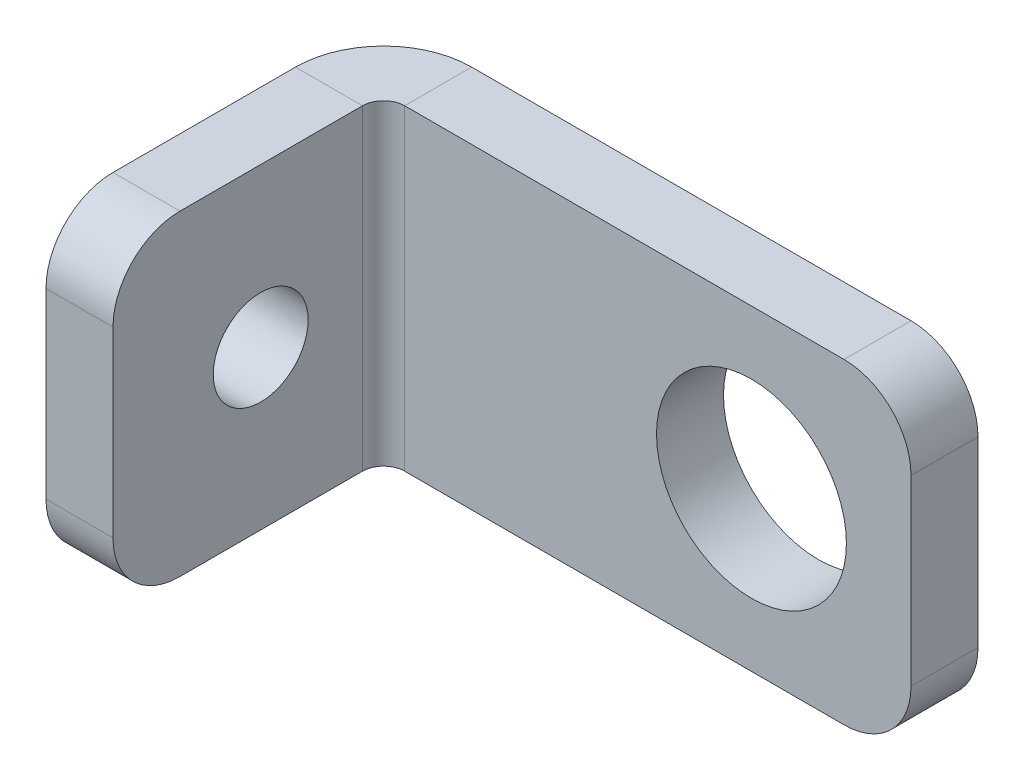
ISO-10303-21;
HEADER;
FILE_DESCRIPTION(('STEP AP214'),'2;1');
FILE_NAME('part.step','',(''),(''),'','','');
FILE_SCHEMA(('AUTOMOTIVE_DESIGN { 1 0 10303 214 1 1 1 1 }'));
ENDSEC;
DATA;
#1=APPLICATION_CONTEXT('core data for automotive mechanical design processes');
#2=APPLICATION_PROTOCOL_DEFINITION('international standard','automotive_design',2000,#1);
#3=PRODUCT_CONTEXT('',#1,'mechanical');
#4=PRODUCT('Part','Part','',(#3));
#5=PRODUCT_RELATED_PRODUCT_CATEGORY('part','',(#4));
#6=PRODUCT_DEFINITION_FORMATION('','',#4);
#7=PRODUCT_DEFINITION_CONTEXT('part definition',#1,'design');
#8=PRODUCT_DEFINITION('design','',#6,#7);
#9=PRODUCT_DEFINITION_SHAPE('','',#8);
#10=(LENGTH_UNIT() NAMED_UNIT(*) SI_UNIT(.MILLI.,.METRE.));
#11=(NAMED_UNIT(*) PLANE_ANGLE_UNIT() SI_UNIT($,.RADIAN.));
#12=(NAMED_UNIT(*) SI_UNIT($,.STERADIAN.) SOLID_ANGLE_UNIT());
#13=UNCERTAINTY_MEASURE_WITH_UNIT(LENGTH_MEASURE(1.E-05),#10,'distance_accuracy_value','');
#14=(GEOMETRIC_REPRESENTATION_CONTEXT(3) GLOBAL_UNCERTAINTY_ASSIGNED_CONTEXT((#13)) GLOBAL_UNIT_ASSIGNED_CONTEXT((#10,
#11,#12)) REPRESENTATION_CONTEXT('',''));
#15=CARTESIAN_POINT('',(0.,0.,0.));
#16=DIRECTION('',(0.,0.,1.));
#17=DIRECTION('',(1.,0.,0.));
#18=AXIS2_PLACEMENT_3D('',#15,#16,#17);
#19=CARTESIAN_POINT('',(-12.5,7.5,3.175));
#20=DIRECTION('',(0.,-1.,0.));
#21=DIRECTION('',(0.,0.,-1.));
#22=AXIS2_PLACEMENT_3D('',#19,#20,#21);
#23=PLANE('',#22);
#24=DIRECTION('',(-1.,0.,0.));
#25=VECTOR('',#24,1.);
#26=CARTESIAN_POINT('',(-12.5,7.5,3.175));
#27=LINE('',#26,#25);
#28=CARTESIAN_POINT('',(9.325,7.5,3.175));
#29=VERTEX_POINT('',#28);
#30=CARTESIAN_POINT('',(-11.5,7.5,3.175));
#31=VERTEX_POINT('',#30);
#32=EDGE_CURVE('E202',#29,#31,#27,.T.);
#33=ORIENTED_EDGE('',*,*,#32,.F.);
#34=DIRECTION('',(0.,0.,-1.));
#35=VECTOR('',#34,1.);
#36=CARTESIAN_POINT('',(9.325,7.5,3.175));
#37=LINE('',#36,#35);
#38=CARTESIAN_POINT('',(9.325,7.5,0.));
#39=VERTEX_POINT('',#38);
#40=EDGE_CURVE('E228',#29,#39,#37,.T.);
#41=ORIENTED_EDGE('',*,*,#40,.T.);
#42=DIRECTION('',(-1.,0.,0.));
#43=VECTOR('',#42,1.);
#44=CARTESIAN_POINT('',(-12.5,7.5,0.));
#45=LINE('',#44,#43);
#46=CARTESIAN_POINT('',(-11.5,7.5,0.));
#47=VERTEX_POINT('',#46);
#48=EDGE_CURVE('E209',#39,#47,#45,.T.);
#49=ORIENTED_EDGE('',*,*,#48,.T.);
#50=DIRECTION('',(0.,0.,-1.));
#51=VECTOR('',#50,1.);
#52=CARTESIAN_POINT('',(-11.5,7.5,3.175));
#53=LINE('',#52,#51);
#54=EDGE_CURVE('E195',#31,#47,#53,.T.);
#55=ORIENTED_EDGE('',*,*,#54,.F.);
#56=EDGE_LOOP('',(#33,#41,#49,#55));
#57=FACE_BOUND('',#56,.T.);
#58=ADVANCED_FACE('F43',(#57),#23,.F.);
#59=CARTESIAN_POINT('',(-12.5,-7.5,3.175));
#60=DIRECTION('',(0.,1.,0.));
#61=DIRECTION('',(0.,0.,1.));
#62=AXIS2_PLACEMENT_3D('',#59,#60,#61);
#63=PLANE('',#62);
#64=DIRECTION('',(1.,0.,0.));
#65=VECTOR('',#64,1.);
#66=CARTESIAN_POINT('',(-12.5,-7.5,0.));
#67=LINE('',#66,#65);
#68=CARTESIAN_POINT('',(-11.5,-7.5,0.));
#69=VERTEX_POINT('',#68);
#70=CARTESIAN_POINT('',(9.325,-7.5,0.));
#71=VERTEX_POINT('',#70);
#72=EDGE_CURVE('E203',#69,#71,#67,.T.);
#73=ORIENTED_EDGE('',*,*,#72,.T.);
#74=DIRECTION('',(0.,0.,-1.));
#75=VECTOR('',#74,1.);
#76=CARTESIAN_POINT('',(9.325,-7.5,3.175));
#77=LINE('',#76,#75);
#78=CARTESIAN_POINT('',(9.325,-7.5,3.175));
#79=VERTEX_POINT('',#78);
#80=EDGE_CURVE('E11',#71,#79,#77,.F.);
#81=ORIENTED_EDGE('',*,*,#80,.T.);
#82=DIRECTION('',(1.,0.,0.));
#83=VECTOR('',#82,1.);
#84=CARTESIAN_POINT('',(-12.5,-7.5,3.175));
#85=LINE('',#84,#83);
#86=CARTESIAN_POINT('',(-11.5,-7.5,3.175));
#87=VERTEX_POINT('',#86);
#88=EDGE_CURVE('E205',#87,#79,#85,.T.);
#89=ORIENTED_EDGE('',*,*,#88,.F.);
#90=DIRECTION('',(0.,0.,-1.));
#91=VECTOR('',#90,1.);
#92=CARTESIAN_POINT('',(-11.5,-7.5,3.175));
#93=LINE('',#92,#91);
#94=EDGE_CURVE('E187',#87,#69,#93,.T.);
#95=ORIENTED_EDGE('',*,*,#94,.T.);
#96=EDGE_LOOP('',(#73,#81,#89,#95));
#97=FACE_BOUND('',#96,.T.);
#98=ADVANCED_FACE('F259',(#97),#63,.F.);
#99=CARTESIAN_POINT('',(0.,0.,3.175));
#100=DIRECTION('',(0.,0.,-1.));
#101=DIRECTION('',(-1.,0.,0.));
#102=AXIS2_PLACEMENT_3D('',#99,#100,#101);
#103=PLANE('',#102);
#104=CARTESIAN_POINT('',(4.93689999991323,-4.73791076063829E-12,3.175));
#105=DIRECTION('',(0.,0.,1.));
#106=DIRECTION('',(1.,0.,0.));
#107=AXIS2_PLACEMENT_3D('',#104,#105,#106);
#108=CIRCLE('',#107,4.5);
#109=CARTESIAN_POINT('',(9.43689999991323,-4.73791076063829E-12,3.175));
#110=VERTEX_POINT('',#109);
#111=EDGE_CURVE('E273',#110,#110,#108,.T.);
#112=ORIENTED_EDGE('',*,*,#111,.F.);
#113=EDGE_LOOP('',(#112));
#114=FACE_BOUND('',#113,.T.);
#115=DIRECTION('',(0.,1.,0.));
#116=VECTOR('',#115,1.);
#117=CARTESIAN_POINT('',(12.5,-7.5,3.175));
#118=LINE('',#117,#116);
#119=CARTESIAN_POINT('',(12.5,-4.325,3.175));
#120=VERTEX_POINT('',#119);
#121=CARTESIAN_POINT('',(12.5,4.325,3.175));
#122=VERTEX_POINT('',#121);
#123=EDGE_CURVE('E200',#120,#122,#118,.T.);
#124=ORIENTED_EDGE('',*,*,#123,.T.);
#125=CARTESIAN_POINT('',(9.325,4.325,3.175));
#126=DIRECTION('',(0.,0.,-1.));
#127=DIRECTION('',(-1.,0.,0.));
#128=AXIS2_PLACEMENT_3D('',#125,#126,#127);
#129=CIRCLE('',#128,3.175);
#130=EDGE_CURVE('E51',#122,#29,#129,.F.);
#131=ORIENTED_EDGE('',*,*,#130,.T.);
#132=ORIENTED_EDGE('',*,*,#32,.T.);
#133=DIRECTION('',(0.,-1.,0.));
#134=VECTOR('',#133,1.);
#135=CARTESIAN_POINT('',(-11.5,-7.5,3.175));
#136=LINE('',#135,#134);
#137=EDGE_CURVE('E191',#87,#31,#136,.F.);
#138=ORIENTED_EDGE('',*,*,#137,.F.);
#139=ORIENTED_EDGE('',*,*,#88,.T.);
#140=CARTESIAN_POINT('',(9.325,-4.325,3.175));
#141=DIRECTION('',(0.,0.,-1.));
#142=DIRECTION('',(-1.,0.,0.));
#143=AXIS2_PLACEMENT_3D('',#140,#141,#142);
#144=CIRCLE('',#143,3.175);
#145=EDGE_CURVE('E239',#79,#120,#144,.F.);
#146=ORIENTED_EDGE('',*,*,#145,.T.);
#147=EDGE_LOOP('',(#124,#131,#132,#138,#139,#146));
#148=FACE_BOUND('',#147,.T.);
#149=ADVANCED_FACE('F243',(#114,#148),#103,.F.);
#150=CARTESIAN_POINT('',(0.,0.,0.));
#151=DIRECTION('',(0.,0.,-1.));
#152=DIRECTION('',(-1.,0.,0.));
#153=AXIS2_PLACEMENT_3D('',#150,#151,#152);
#154=PLANE('',#153);
#155=CARTESIAN_POINT('',(4.93689999991323,-4.73791076063829E-12,0.));
#156=DIRECTION('',(0.,0.,1.));
#157=DIRECTION('',(1.,0.,0.));
#158=AXIS2_PLACEMENT_3D('',#155,#156,#157);
#159=CIRCLE('',#158,4.5);
#160=CARTESIAN_POINT('',(9.43689999991323,-4.73791076063829E-12,0.));
#161=VERTEX_POINT('',#160);
#162=EDGE_CURVE('E269',#161,#161,#159,.T.);
#163=ORIENTED_EDGE('',*,*,#162,.T.);
#164=EDGE_LOOP('',(#163));
#165=FACE_BOUND('',#164,.T.);
#166=ORIENTED_EDGE('',*,*,#48,.F.);
#167=CARTESIAN_POINT('',(9.325,4.325,0.));
#168=DIRECTION('',(0.,0.,-1.));
#169=DIRECTION('',(-1.,0.,0.));
#170=AXIS2_PLACEMENT_3D('',#167,#168,#169);
#171=CIRCLE('',#170,3.175);
#172=CARTESIAN_POINT('',(12.5,4.325,0.));
#173=VERTEX_POINT('',#172);
#174=EDGE_CURVE('E233',#39,#173,#171,.T.);
#175=ORIENTED_EDGE('',*,*,#174,.T.);
#176=DIRECTION('',(0.,1.,0.));
#177=VECTOR('',#176,1.);
#178=CARTESIAN_POINT('',(12.5,-7.5,0.));
#179=LINE('',#178,#177);
#180=CARTESIAN_POINT('',(12.5,-4.325,0.));
#181=VERTEX_POINT('',#180);
#182=EDGE_CURVE('E198',#181,#173,#179,.T.);
#183=ORIENTED_EDGE('',*,*,#182,.F.);
#184=CARTESIAN_POINT('',(9.325,-4.325,0.));
#185=DIRECTION('',(0.,0.,-1.));
#186=DIRECTION('',(-1.,0.,0.));
#187=AXIS2_PLACEMENT_3D('',#184,#185,#186);
#188=CIRCLE('',#187,3.175);
#189=EDGE_CURVE('E231',#181,#71,#188,.T.);
#190=ORIENTED_EDGE('',*,*,#189,.T.);
#191=ORIENTED_EDGE('',*,*,#72,.F.);
#192=DIRECTION('',(0.,-1.,0.));
#193=VECTOR('',#192,1.);
#194=CARTESIAN_POINT('',(-11.5,-7.5,0.));
#195=LINE('',#194,#193);
#196=EDGE_CURVE('E156',#69,#47,#195,.F.);
#197=ORIENTED_EDGE('',*,*,#196,.T.);
#198=EDGE_LOOP('',(#166,#175,#183,#190,#191,#197));
#199=FACE_BOUND('',#198,.T.);
#200=ADVANCED_FACE('F253',(#165,#199),#154,.T.);
#201=CARTESIAN_POINT('',(12.5,-7.5,3.175));
#202=DIRECTION('',(-1.,0.,0.));
#203=DIRECTION('',(0.,0.,1.));
#204=AXIS2_PLACEMENT_3D('',#201,#202,#203);
#205=PLANE('',#204);
#206=ORIENTED_EDGE('',*,*,#182,.T.);
#207=DIRECTION('',(0.,0.,-1.));
#208=VECTOR('',#207,1.);
#209=CARTESIAN_POINT('',(12.5,4.325,3.175));
#210=LINE('',#209,#208);
#211=EDGE_CURVE('E64',#173,#122,#210,.F.);
#212=ORIENTED_EDGE('',*,*,#211,.T.);
#213=ORIENTED_EDGE('',*,*,#123,.F.);
#214=DIRECTION('',(0.,0.,-1.));
#215=VECTOR('',#214,1.);
#216=CARTESIAN_POINT('',(12.5,-4.325,3.175));
#217=LINE('',#216,#215);
#218=EDGE_CURVE('E235',#120,#181,#217,.T.);
#219=ORIENTED_EDGE('',*,*,#218,.T.);
#220=EDGE_LOOP('',(#206,#212,#213,#219));
#221=FACE_BOUND('',#220,.T.);
#222=ADVANCED_FACE('F254',(#221),#205,.F.);
#223=CARTESIAN_POINT('',(-11.5,7.5,4.175));
#224=DIRECTION('',(0.,1.,0.));
#225=DIRECTION('',(0.,0.,1.));
#226=AXIS2_PLACEMENT_3D('',#223,#224,#225);
#227=PLANE('',#226);
#228=DIRECTION('',(-1.,0.,0.));
#229=VECTOR('',#228,1.);
#230=CARTESIAN_POINT('',(-12.5,7.5,4.175));
#231=LINE('',#230,#229);
#232=CARTESIAN_POINT('',(-12.5,7.5,4.175));
#233=VERTEX_POINT('',#232);
#234=CARTESIAN_POINT('',(-15.675,7.5,4.17499999999999));
#235=VERTEX_POINT('',#234);
#236=EDGE_CURVE('E177',#233,#235,#231,.T.);
#237=ORIENTED_EDGE('',*,*,#236,.F.);
#238=CARTESIAN_POINT('',(-11.5,7.5,4.175));
#239=DIRECTION('',(0.,-1.,0.));
#240=DIRECTION('',(0.,0.,-1.));
#241=AXIS2_PLACEMENT_3D('',#238,#239,#240);
#242=CIRCLE('',#241,1.);
#243=EDGE_CURVE('E159',#31,#233,#242,.F.);
#244=ORIENTED_EDGE('',*,*,#243,.F.);
#245=ORIENTED_EDGE('',*,*,#54,.T.);
#246=CARTESIAN_POINT('',(-11.5,7.5,4.175));
#247=DIRECTION('',(0.,-1.,0.));
#248=DIRECTION('',(0.,0.,-1.));
#249=AXIS2_PLACEMENT_3D('',#246,#247,#248);
#250=CIRCLE('',#249,4.175);
#251=EDGE_CURVE('E186',#47,#235,#250,.F.);
#252=ORIENTED_EDGE('',*,*,#251,.T.);
#253=EDGE_LOOP('',(#237,#244,#245,#252));
#254=FACE_BOUND('',#253,.T.);
#255=ADVANCED_FACE('F301',(#254),#227,.T.);
#256=CARTESIAN_POINT('',(-11.5,-7.5,4.175));
#257=DIRECTION('',(0.,1.,0.));
#258=DIRECTION('',(0.,0.,1.));
#259=AXIS2_PLACEMENT_3D('',#256,#257,#258);
#260=PLANE('',#259);
#261=CARTESIAN_POINT('',(-11.5,-7.5,4.175));
#262=DIRECTION('',(0.,-1.,0.));
#263=DIRECTION('',(0.,0.,-1.));
#264=AXIS2_PLACEMENT_3D('',#261,#262,#263);
#265=CIRCLE('',#264,1.);
#266=CARTESIAN_POINT('',(-12.5,-7.5,4.175));
#267=VERTEX_POINT('',#266);
#268=EDGE_CURVE('E145',#267,#87,#265,.T.);
#269=ORIENTED_EDGE('',*,*,#268,.F.);
#270=DIRECTION('',(-1.,0.,0.));
#271=VECTOR('',#270,1.);
#272=CARTESIAN_POINT('',(-12.5,-7.5,4.175));
#273=LINE('',#272,#271);
#274=CARTESIAN_POINT('',(-15.675,-7.5,4.17499999999999));
#275=VERTEX_POINT('',#274);
#276=EDGE_CURVE('E139',#267,#275,#273,.T.);
#277=ORIENTED_EDGE('',*,*,#276,.T.);
#278=CARTESIAN_POINT('',(-11.5,-7.5,4.175));
#279=DIRECTION('',(0.,-1.,0.));
#280=DIRECTION('',(0.,0.,-1.));
#281=AXIS2_PLACEMENT_3D('',#278,#279,#280);
#282=CIRCLE('',#281,4.175);
#283=EDGE_CURVE('E150',#275,#69,#282,.T.);
#284=ORIENTED_EDGE('',*,*,#283,.T.);
#285=ORIENTED_EDGE('',*,*,#94,.F.);
#286=EDGE_LOOP('',(#269,#277,#284,#285));
#287=FACE_BOUND('',#286,.T.);
#288=ADVANCED_FACE('F162',(#287),#260,.F.);
#289=CARTESIAN_POINT('',(-11.5,-7.5,4.175));
#290=DIRECTION('',(0.,-1.,0.));
#291=DIRECTION('',(-1.,0.,0.));
#292=AXIS2_PLACEMENT_3D('',#289,#290,#291);
#293=CYLINDRICAL_SURFACE('',#292,4.175);
#294=ORIENTED_EDGE('',*,*,#196,.F.);
#295=ORIENTED_EDGE('',*,*,#283,.F.);
#296=DIRECTION('',(0.,-1.,0.));
#297=VECTOR('',#296,1.);
#298=CARTESIAN_POINT('',(-15.675,0.,4.17499999999999));
#299=LINE('',#298,#297);
#300=EDGE_CURVE('E153',#235,#275,#299,.T.);
#301=ORIENTED_EDGE('',*,*,#300,.F.);
#302=ORIENTED_EDGE('',*,*,#251,.F.);
#303=EDGE_LOOP('',(#294,#295,#301,#302));
#304=FACE_BOUND('',#303,.T.);
#305=ADVANCED_FACE('F151',(#304),#293,.T.);
#306=CARTESIAN_POINT('',(-11.5,-7.5,4.175));
#307=DIRECTION('',(0.,-1.,0.));
#308=DIRECTION('',(-1.,0.,0.));
#309=AXIS2_PLACEMENT_3D('',#306,#307,#308);
#310=CYLINDRICAL_SURFACE('',#309,1.);
#311=ORIENTED_EDGE('',*,*,#137,.T.);
#312=ORIENTED_EDGE('',*,*,#243,.T.);
#313=DIRECTION('',(0.,-1.,0.));
#314=VECTOR('',#313,1.);
#315=CARTESIAN_POINT('',(-12.5,7.5,4.175));
#316=LINE('',#315,#314);
#317=EDGE_CURVE('E164',#233,#267,#316,.T.);
#318=ORIENTED_EDGE('',*,*,#317,.T.);
#319=ORIENTED_EDGE('',*,*,#268,.T.);
#320=EDGE_LOOP('',(#311,#312,#318,#319));
#321=FACE_BOUND('',#320,.T.);
#322=ADVANCED_FACE('F262',(#321),#310,.F.);
#323=CARTESIAN_POINT('',(-15.675,-7.5,3.17499999999999));
#324=DIRECTION('',(0.,-1.,0.));
#325=DIRECTION('',(0.,0.,-1.));
#326=AXIS2_PLACEMENT_3D('',#323,#324,#325);
#327=PLANE('',#326);
#328=DIRECTION('',(0.,0.,-1.));
#329=VECTOR('',#328,1.);
#330=CARTESIAN_POINT('',(-12.5,-7.5,3.175));
#331=LINE('',#330,#329);
#332=CARTESIAN_POINT('',(-12.5,-7.5,12.825));
#333=VERTEX_POINT('',#332);
#334=EDGE_CURVE('E179',#333,#267,#331,.T.);
#335=ORIENTED_EDGE('',*,*,#334,.F.);
#336=DIRECTION('',(1.,0.,0.));
#337=VECTOR('',#336,1.);
#338=CARTESIAN_POINT('',(-15.675,-7.5,12.825));
#339=LINE('',#338,#337);
#340=CARTESIAN_POINT('',(-15.675,-7.5,12.825));
#341=VERTEX_POINT('',#340);
#342=EDGE_CURVE('E141',#333,#341,#339,.F.);
#343=ORIENTED_EDGE('',*,*,#342,.T.);
#344=DIRECTION('',(0.,0.,-1.));
#345=VECTOR('',#344,1.);
#346=CARTESIAN_POINT('',(-15.675,-7.5,3.17499999999999));
#347=LINE('',#346,#345);
#348=EDGE_CURVE('E134',#341,#275,#347,.T.);
#349=ORIENTED_EDGE('',*,*,#348,.T.);
#350=ORIENTED_EDGE('',*,*,#276,.F.);
#351=EDGE_LOOP('',(#335,#343,#349,#350));
#352=FACE_BOUND('',#351,.T.);
#353=ADVANCED_FACE('F137',(#352),#327,.T.);
#354=CARTESIAN_POINT('',(-15.675,7.5,16.));
#355=DIRECTION('',(0.,1.,0.));
#356=DIRECTION('',(0.,0.,1.));
#357=AXIS2_PLACEMENT_3D('',#354,#355,#356);
#358=PLANE('',#357);
#359=DIRECTION('',(0.,0.,1.));
#360=VECTOR('',#359,1.);
#361=CARTESIAN_POINT('',(-15.675,7.5,16.));
#362=LINE('',#361,#360);
#363=CARTESIAN_POINT('',(-15.675,7.5,12.825));
#364=VERTEX_POINT('',#363);
#365=EDGE_CURVE('E169',#235,#364,#362,.T.);
#366=ORIENTED_EDGE('',*,*,#365,.T.);
#367=DIRECTION('',(1.,0.,0.));
#368=VECTOR('',#367,1.);
#369=CARTESIAN_POINT('',(-15.675,7.5,12.825));
#370=LINE('',#369,#368);
#371=CARTESIAN_POINT('',(-12.5,7.5,12.825));
#372=VERTEX_POINT('',#371);
#373=EDGE_CURVE('E225',#364,#372,#370,.T.);
#374=ORIENTED_EDGE('',*,*,#373,.T.);
#375=DIRECTION('',(0.,0.,1.));
#376=VECTOR('',#375,1.);
#377=CARTESIAN_POINT('',(-12.5,7.5,16.));
#378=LINE('',#377,#376);
#379=EDGE_CURVE('E170',#233,#372,#378,.T.);
#380=ORIENTED_EDGE('',*,*,#379,.F.);
#381=ORIENTED_EDGE('',*,*,#236,.T.);
#382=EDGE_LOOP('',(#366,#374,#380,#381));
#383=FACE_BOUND('',#382,.T.);
#384=ADVANCED_FACE('F299',(#383),#358,.T.);
#385=CARTESIAN_POINT('',(-15.675,0.,0.));
#386=DIRECTION('',(-1.,0.,0.));
#387=DIRECTION('',(0.,0.,1.));
#388=AXIS2_PLACEMENT_3D('',#385,#386,#387);
#389=PLANE('',#388);
#390=CARTESIAN_POINT('',(-15.6750000000001,0.,9.00000000001472));
#391=DIRECTION('',(1.,0.,0.));
#392=DIRECTION('',(0.,0.,-1.));
#393=AXIS2_PLACEMENT_3D('',#390,#391,#392);
#394=CIRCLE('',#393,2.25);
#395=CARTESIAN_POINT('',(-15.6750000000001,0.,6.75000000001472));
#396=VERTEX_POINT('',#395);
#397=EDGE_CURVE('E276',#396,#396,#394,.T.);
#398=ORIENTED_EDGE('',*,*,#397,.T.);
#399=EDGE_LOOP('',(#398));
#400=FACE_BOUND('',#399,.T.);
#401=ORIENTED_EDGE('',*,*,#348,.F.);
#402=CARTESIAN_POINT('',(-15.675,-4.325,12.825));
#403=DIRECTION('',(-1.,0.,0.));
#404=DIRECTION('',(0.,0.,1.));
#405=AXIS2_PLACEMENT_3D('',#402,#403,#404);
#406=CIRCLE('',#405,3.175);
#407=CARTESIAN_POINT('',(-15.675,-4.325,16.));
#408=VERTEX_POINT('',#407);
#409=EDGE_CURVE('E223',#341,#408,#406,.T.);
#410=ORIENTED_EDGE('',*,*,#409,.T.);
#411=DIRECTION('',(0.,-1.,0.));
#412=VECTOR('',#411,1.);
#413=CARTESIAN_POINT('',(-15.675,-7.5,16.));
#414=LINE('',#413,#412);
#415=CARTESIAN_POINT('',(-15.675,4.325,16.));
#416=VERTEX_POINT('',#415);
#417=EDGE_CURVE('E146',#416,#408,#414,.T.);
#418=ORIENTED_EDGE('',*,*,#417,.F.);
#419=CARTESIAN_POINT('',(-15.675,4.325,12.825));
#420=DIRECTION('',(-1.,0.,0.));
#421=DIRECTION('',(0.,0.,1.));
#422=AXIS2_PLACEMENT_3D('',#419,#420,#421);
#423=CIRCLE('',#422,3.175);
#424=EDGE_CURVE('E221',#416,#364,#423,.T.);
#425=ORIENTED_EDGE('',*,*,#424,.T.);
#426=ORIENTED_EDGE('',*,*,#365,.F.);
#427=ORIENTED_EDGE('',*,*,#300,.T.);
#428=EDGE_LOOP('',(#401,#410,#418,#425,#426,#427));
#429=FACE_BOUND('',#428,.T.);
#430=ADVANCED_FACE('F167',(#400,#429),#389,.T.);
#431=CARTESIAN_POINT('',(-12.5,0.,0.));
#432=DIRECTION('',(-1.,0.,0.));
#433=DIRECTION('',(0.,0.,1.));
#434=AXIS2_PLACEMENT_3D('',#431,#432,#433);
#435=PLANE('',#434);
#436=CARTESIAN_POINT('',(-12.5,0.,9.00000000001473));
#437=DIRECTION('',(1.,0.,0.));
#438=DIRECTION('',(0.,0.,-1.));
#439=AXIS2_PLACEMENT_3D('',#436,#437,#438);
#440=CIRCLE('',#439,2.24999999999999);
#441=CARTESIAN_POINT('',(-12.5,0.,6.75000000001474));
#442=VERTEX_POINT('',#441);
#443=EDGE_CURVE('E279',#442,#442,#440,.T.);
#444=ORIENTED_EDGE('',*,*,#443,.F.);
#445=EDGE_LOOP('',(#444));
#446=FACE_BOUND('',#445,.T.);
#447=DIRECTION('',(0.,-1.,0.));
#448=VECTOR('',#447,1.);
#449=CARTESIAN_POINT('',(-12.5,-7.5,16.));
#450=LINE('',#449,#448);
#451=CARTESIAN_POINT('',(-12.5,4.325,16.));
#452=VERTEX_POINT('',#451);
#453=CARTESIAN_POINT('',(-12.5,-4.325,16.));
#454=VERTEX_POINT('',#453);
#455=EDGE_CURVE('E173',#452,#454,#450,.T.);
#456=ORIENTED_EDGE('',*,*,#455,.T.);
#457=CARTESIAN_POINT('',(-12.5,-4.325,12.825));
#458=DIRECTION('',(-1.,0.,0.));
#459=DIRECTION('',(0.,0.,1.));
#460=AXIS2_PLACEMENT_3D('',#457,#458,#459);
#461=CIRCLE('',#460,3.175);
#462=EDGE_CURVE('E218',#454,#333,#461,.F.);
#463=ORIENTED_EDGE('',*,*,#462,.T.);
#464=ORIENTED_EDGE('',*,*,#334,.T.);
#465=ORIENTED_EDGE('',*,*,#317,.F.);
#466=ORIENTED_EDGE('',*,*,#379,.T.);
#467=CARTESIAN_POINT('',(-12.5,4.325,12.825));
#468=DIRECTION('',(-1.,0.,0.));
#469=DIRECTION('',(0.,0.,1.));
#470=AXIS2_PLACEMENT_3D('',#467,#468,#469);
#471=CIRCLE('',#470,3.175);
#472=EDGE_CURVE('E216',#372,#452,#471,.F.);
#473=ORIENTED_EDGE('',*,*,#472,.T.);
#474=EDGE_LOOP('',(#456,#463,#464,#465,#466,#473));
#475=FACE_BOUND('',#474,.T.);
#476=ADVANCED_FACE('F285',(#446,#475),#435,.F.);
#477=CARTESIAN_POINT('',(-15.675,-7.5,16.));
#478=DIRECTION('',(0.,0.,1.));
#479=DIRECTION('',(1.,0.,0.));
#480=AXIS2_PLACEMENT_3D('',#477,#478,#479);
#481=PLANE('',#480);
#482=ORIENTED_EDGE('',*,*,#417,.T.);
#483=DIRECTION('',(1.,0.,0.));
#484=VECTOR('',#483,1.);
#485=CARTESIAN_POINT('',(-15.675,-4.325,16.));
#486=LINE('',#485,#484);
#487=EDGE_CURVE('E213',#408,#454,#486,.T.);
#488=ORIENTED_EDGE('',*,*,#487,.T.);
#489=ORIENTED_EDGE('',*,*,#455,.F.);
#490=DIRECTION('',(1.,0.,0.));
#491=VECTOR('',#490,1.);
#492=CARTESIAN_POINT('',(-15.675,4.325,16.));
#493=LINE('',#492,#491);
#494=EDGE_CURVE('E207',#452,#416,#493,.F.);
#495=ORIENTED_EDGE('',*,*,#494,.T.);
#496=EDGE_LOOP('',(#482,#488,#489,#495));
#497=FACE_BOUND('',#496,.T.);
#498=ADVANCED_FACE('F287',(#497),#481,.T.);
#499=CARTESIAN_POINT('',(4.93689999991323,-4.73791076063829E-12,3.175));
#500=DIRECTION('',(0.,0.,1.));
#501=DIRECTION('',(1.,0.,0.));
#502=AXIS2_PLACEMENT_3D('',#499,#500,#501);
#503=CYLINDRICAL_SURFACE('',#502,4.5);
#504=ORIENTED_EDGE('',*,*,#162,.F.);
#505=EDGE_LOOP('',(#504));
#506=FACE_BOUND('',#505,.T.);
#507=ORIENTED_EDGE('',*,*,#111,.T.);
#508=EDGE_LOOP('',(#507));
#509=FACE_BOUND('',#508,.T.);
#510=ADVANCED_FACE('F323',(#506,#509),#503,.F.);
#511=CARTESIAN_POINT('',(-15.675,-4.325,12.825));
#512=DIRECTION('',(1.,0.,0.));
#513=DIRECTION('',(0.,0.,-1.));
#514=AXIS2_PLACEMENT_3D('',#511,#512,#513);
#515=CYLINDRICAL_SURFACE('',#514,3.175);
#516=ORIENTED_EDGE('',*,*,#409,.F.);
#517=ORIENTED_EDGE('',*,*,#342,.F.);
#518=ORIENTED_EDGE('',*,*,#462,.F.);
#519=ORIENTED_EDGE('',*,*,#487,.F.);
#520=EDGE_LOOP('',(#516,#517,#518,#519));
#521=FACE_BOUND('',#520,.T.);
#522=ADVANCED_FACE('F320',(#521),#515,.T.);
#523=CARTESIAN_POINT('',(-15.675,4.325,12.825));
#524=DIRECTION('',(1.,0.,0.));
#525=DIRECTION('',(0.,0.,-1.));
#526=AXIS2_PLACEMENT_3D('',#523,#524,#525);
#527=CYLINDRICAL_SURFACE('',#526,3.175);
#528=ORIENTED_EDGE('',*,*,#424,.F.);
#529=ORIENTED_EDGE('',*,*,#494,.F.);
#530=ORIENTED_EDGE('',*,*,#472,.F.);
#531=ORIENTED_EDGE('',*,*,#373,.F.);
#532=EDGE_LOOP('',(#528,#529,#530,#531));
#533=FACE_BOUND('',#532,.T.);
#534=ADVANCED_FACE('F296',(#533),#527,.T.);
#535=CARTESIAN_POINT('',(9.325,4.325,3.175));
#536=DIRECTION('',(0.,0.,-1.));
#537=DIRECTION('',(-1.,0.,0.));
#538=AXIS2_PLACEMENT_3D('',#535,#536,#537);
#539=CYLINDRICAL_SURFACE('',#538,3.175);
#540=ORIENTED_EDGE('',*,*,#130,.F.);
#541=ORIENTED_EDGE('',*,*,#211,.F.);
#542=ORIENTED_EDGE('',*,*,#174,.F.);
#543=ORIENTED_EDGE('',*,*,#40,.F.);
#544=EDGE_LOOP('',(#540,#541,#542,#543));
#545=FACE_BOUND('',#544,.T.);
#546=ADVANCED_FACE('F250',(#545),#539,.T.);
#547=CARTESIAN_POINT('',(9.325,-4.325,3.175));
#548=DIRECTION('',(0.,0.,-1.));
#549=DIRECTION('',(-1.,0.,0.));
#550=AXIS2_PLACEMENT_3D('',#547,#548,#549);
#551=CYLINDRICAL_SURFACE('',#550,3.175);
#552=ORIENTED_EDGE('',*,*,#145,.F.);
#553=ORIENTED_EDGE('',*,*,#80,.F.);
#554=ORIENTED_EDGE('',*,*,#189,.F.);
#555=ORIENTED_EDGE('',*,*,#218,.F.);
#556=EDGE_LOOP('',(#552,#553,#554,#555));
#557=FACE_BOUND('',#556,.T.);
#558=ADVANCED_FACE('F45',(#557),#551,.T.);
#559=CARTESIAN_POINT('',(-12.5,0.,9.00000000001473));
#560=DIRECTION('',(1.,0.,0.));
#561=DIRECTION('',(0.,0.,-1.));
#562=AXIS2_PLACEMENT_3D('',#559,#560,#561);
#563=CYLINDRICAL_SURFACE('',#562,2.24999999999999);
#564=ORIENTED_EDGE('',*,*,#397,.F.);
#565=EDGE_LOOP('',(#564));
#566=FACE_BOUND('',#565,.T.);
#567=ORIENTED_EDGE('',*,*,#443,.T.);
#568=EDGE_LOOP('',(#567));
#569=FACE_BOUND('',#568,.T.);
#570=ADVANCED_FACE('F283',(#566,#569),#563,.F.);
#571=CLOSED_SHELL('',(#58,#98,#149,#200,#222,#255,#288,#305,#322,#353,#384,#430,#476,#498,#510,
#522,#534,#546,#558,#570));
#572=MANIFOLD_SOLID_BREP('B2',#571);
#573=ADVANCED_BREP_SHAPE_REPRESENTATION('',(#18,#572),#14);
#574=SHAPE_DEFINITION_REPRESENTATION(#9,#573);
ENDSEC;
END-ISO-10303-21;
